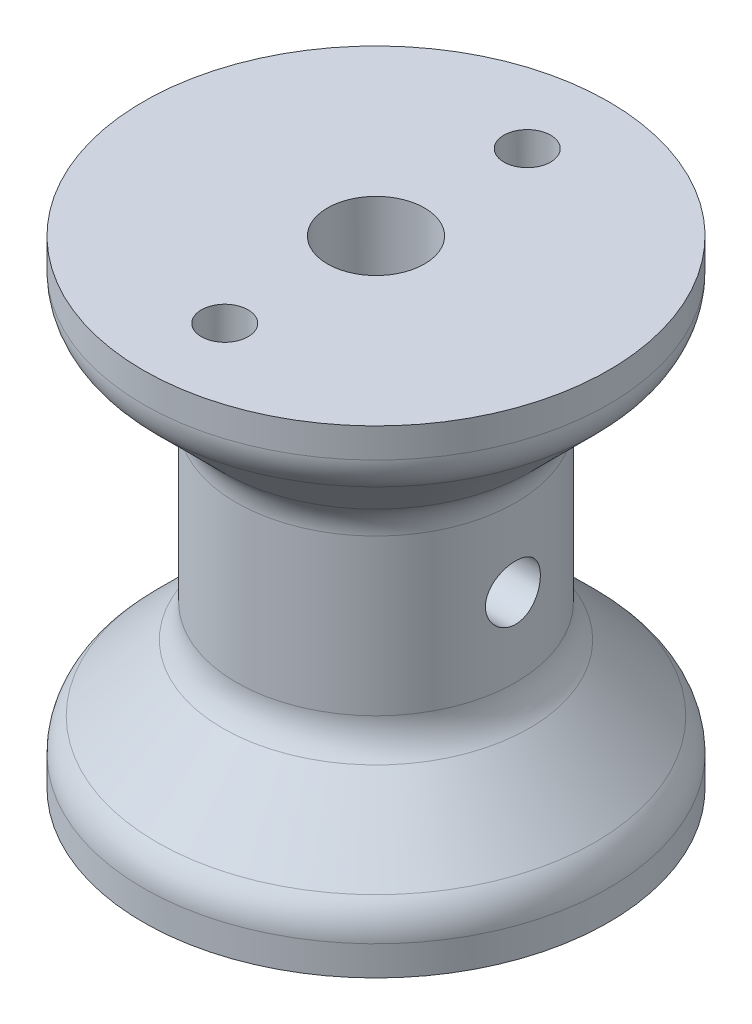
ISO-10303-21;
HEADER;
FILE_DESCRIPTION(('STEP AP214'),'2;1');
FILE_NAME('part.step','',(''),(''),'','','');
FILE_SCHEMA(('AUTOMOTIVE_DESIGN { 1 0 10303 214 1 1 1 1 }'));
ENDSEC;
DATA;
#1=APPLICATION_CONTEXT('core data for automotive mechanical design processes');
#2=APPLICATION_PROTOCOL_DEFINITION('international standard','automotive_design',2000,#1);
#3=PRODUCT_CONTEXT('',#1,'mechanical');
#4=PRODUCT('Part','Part','',(#3));
#5=PRODUCT_RELATED_PRODUCT_CATEGORY('part','',(#4));
#6=PRODUCT_DEFINITION_FORMATION('','',#4);
#7=PRODUCT_DEFINITION_CONTEXT('part definition',#1,'design');
#8=PRODUCT_DEFINITION('design','',#6,#7);
#9=PRODUCT_DEFINITION_SHAPE('','',#8);
#10=(LENGTH_UNIT() NAMED_UNIT(*) SI_UNIT(.MILLI.,.METRE.));
#11=(NAMED_UNIT(*) PLANE_ANGLE_UNIT() SI_UNIT($,.RADIAN.));
#12=(NAMED_UNIT(*) SI_UNIT($,.STERADIAN.) SOLID_ANGLE_UNIT());
#13=UNCERTAINTY_MEASURE_WITH_UNIT(LENGTH_MEASURE(1.E-05),#10,'distance_accuracy_value','');
#14=(GEOMETRIC_REPRESENTATION_CONTEXT(3) GLOBAL_UNCERTAINTY_ASSIGNED_CONTEXT((#13)) GLOBAL_UNIT_ASSIGNED_CONTEXT((#10,
#11,#12)) REPRESENTATION_CONTEXT('',''));
#15=CARTESIAN_POINT('',(0.,0.,0.));
#16=DIRECTION('',(0.,0.,1.));
#17=DIRECTION('',(1.,0.,0.));
#18=AXIS2_PLACEMENT_3D('',#15,#16,#17);
#19=CARTESIAN_POINT('',(0.,31.047,0.));
#20=DIRECTION('',(0.,-1.,0.));
#21=DIRECTION('',(0.,0.,-1.));
#22=AXIS2_PLACEMENT_3D('',#19,#20,#21);
#23=PLANE('',#22);
#24=CARTESIAN_POINT('',(0.,31.047,0.));
#25=DIRECTION('',(0.,-1.,0.));
#26=DIRECTION('',(0.,0.,-1.));
#27=AXIS2_PLACEMENT_3D('',#24,#25,#26);
#28=CIRCLE('',#27,12.7);
#29=CARTESIAN_POINT('',(0.,31.047,-12.7));
#30=VERTEX_POINT('',#29);
#31=EDGE_CURVE('E49',#30,#30,#28,.T.);
#32=ORIENTED_EDGE('',*,*,#31,.F.);
#33=EDGE_LOOP('',(#32));
#34=FACE_BOUND('',#33,.T.);
#35=CARTESIAN_POINT('',(0.,31.047,0.));
#36=DIRECTION('',(0.,-1.,0.));
#37=DIRECTION('',(0.,0.,-1.));
#38=AXIS2_PLACEMENT_3D('',#35,#36,#37);
#39=CIRCLE('',#38,2.64999999999999);
#40=CARTESIAN_POINT('',(0.,31.047,-2.64999999999999));
#41=VERTEX_POINT('',#40);
#42=EDGE_CURVE('E142',#41,#41,#39,.F.);
#43=ORIENTED_EDGE('',*,*,#42,.F.);
#44=EDGE_LOOP('',(#43));
#45=FACE_BOUND('',#44,.T.);
#46=CARTESIAN_POINT('',(0.,31.047,8.255));
#47=DIRECTION('',(0.,-1.,0.));
#48=DIRECTION('',(0.,0.,-1.));
#49=AXIS2_PLACEMENT_3D('',#46,#47,#48);
#50=CIRCLE('',#49,1.275);
#51=CARTESIAN_POINT('',(0.,31.047,6.98));
#52=VERTEX_POINT('',#51);
#53=EDGE_CURVE('E140',#52,#52,#50,.F.);
#54=ORIENTED_EDGE('',*,*,#53,.F.);
#55=EDGE_LOOP('',(#54));
#56=FACE_BOUND('',#55,.T.);
#57=CARTESIAN_POINT('',(0.,31.047,-8.255));
#58=DIRECTION('',(0.,-1.,0.));
#59=DIRECTION('',(0.,0.,-1.));
#60=AXIS2_PLACEMENT_3D('',#57,#58,#59);
#61=CIRCLE('',#60,1.275);
#62=CARTESIAN_POINT('',(0.,31.047,-9.53));
#63=VERTEX_POINT('',#62);
#64=EDGE_CURVE('E136',#63,#63,#61,.F.);
#65=ORIENTED_EDGE('',*,*,#64,.F.);
#66=EDGE_LOOP('',(#65));
#67=FACE_BOUND('',#66,.T.);
#68=ADVANCED_FACE('F45',(#34,#45,#56,#67),#23,.F.);
#69=CARTESIAN_POINT('',(0.,4.953,0.));
#70=DIRECTION('',(0.,1.,0.));
#71=DIRECTION('',(0.,0.,1.));
#72=AXIS2_PLACEMENT_3D('',#69,#70,#71);
#73=PLANE('',#72);
#74=CARTESIAN_POINT('',(0.,4.953,0.));
#75=DIRECTION('',(0.,1.,0.));
#76=DIRECTION('',(-0.199709980514393,0.,0.97985505238425));
#77=AXIS2_PLACEMENT_3D('',#74,#75,#76);
#78=CIRCLE('',#77,12.7);
#79=CARTESIAN_POINT('',(-2.53631675253279,4.953,12.44415916528));
#80=VERTEX_POINT('',#79);
#81=EDGE_CURVE('E126',#80,#80,#78,.T.);
#82=ORIENTED_EDGE('',*,*,#81,.F.);
#83=EDGE_LOOP('',(#82));
#84=FACE_BOUND('',#83,.T.);
#85=CARTESIAN_POINT('',(0.,4.953,0.));
#86=DIRECTION('',(0.,1.,0.));
#87=DIRECTION('',(0.,0.,1.));
#88=AXIS2_PLACEMENT_3D('',#85,#86,#87);
#89=CIRCLE('',#88,2.64999999999999);
#90=CARTESIAN_POINT('',(0.,4.953,2.64999999999999));
#91=VERTEX_POINT('',#90);
#92=EDGE_CURVE('E144',#91,#91,#89,.F.);
#93=ORIENTED_EDGE('',*,*,#92,.F.);
#94=EDGE_LOOP('',(#93));
#95=FACE_BOUND('',#94,.T.);
#96=CARTESIAN_POINT('',(0.,4.953,8.255));
#97=DIRECTION('',(0.,1.,0.));
#98=DIRECTION('',(0.,0.,1.));
#99=AXIS2_PLACEMENT_3D('',#96,#97,#98);
#100=CIRCLE('',#99,1.25);
#101=CARTESIAN_POINT('',(0.,4.953,9.505));
#102=VERTEX_POINT('',#101);
#103=EDGE_CURVE('E139',#102,#102,#100,.F.);
#104=ORIENTED_EDGE('',*,*,#103,.F.);
#105=EDGE_LOOP('',(#104));
#106=FACE_BOUND('',#105,.T.);
#107=CARTESIAN_POINT('',(0.,4.953,-8.255));
#108=DIRECTION('',(0.,1.,0.));
#109=DIRECTION('',(0.,0.,1.));
#110=AXIS2_PLACEMENT_3D('',#107,#108,#109);
#111=CIRCLE('',#110,1.25);
#112=CARTESIAN_POINT('',(0.,4.953,-7.005));
#113=VERTEX_POINT('',#112);
#114=EDGE_CURVE('E154',#113,#113,#111,.F.);
#115=ORIENTED_EDGE('',*,*,#114,.F.);
#116=EDGE_LOOP('',(#115));
#117=FACE_BOUND('',#116,.T.);
#118=ADVANCED_FACE('F89',(#84,#95,#106,#117),#73,.F.);
#119=CARTESIAN_POINT('',(0.,36.,8.255));
#120=DIRECTION('',(0.,1.,0.));
#121=DIRECTION('',(0.,0.,1.));
#122=AXIS2_PLACEMENT_3D('',#119,#120,#121);
#123=CYLINDRICAL_SURFACE('',#122,1.275);
#124=CARTESIAN_POINT('',(0.,26.094,8.255));
#125=DIRECTION('',(0.,1.,0.));
#126=DIRECTION('',(0.,0.,1.));
#127=AXIS2_PLACEMENT_3D('',#124,#125,#126);
#128=CIRCLE('',#127,1.275);
#129=CARTESIAN_POINT('',(0.,26.094,9.53));
#130=VERTEX_POINT('',#129);
#131=EDGE_CURVE('E128',#130,#130,#128,.T.);
#132=ORIENTED_EDGE('',*,*,#131,.F.);
#133=EDGE_LOOP('',(#132));
#134=FACE_BOUND('',#133,.T.);
#135=ORIENTED_EDGE('',*,*,#53,.T.);
#136=EDGE_LOOP('',(#135));
#137=FACE_BOUND('',#136,.T.);
#138=ADVANCED_FACE('F80',(#134,#137),#123,.F.);
#139=CARTESIAN_POINT('',(0.,26.094,8.255));
#140=DIRECTION('',(0.,1.,0.));
#141=DIRECTION('',(0.,0.,1.));
#142=AXIS2_PLACEMENT_3D('',#139,#140,#141);
#143=CONICAL_SURFACE('',#142,1.275,0.872664625997162);
#144=ORIENTED_EDGE('',*,*,#131,.T.);
#145=EDGE_LOOP('',(#144));
#146=FACE_BOUND('',#145,.T.);
#147=CARTESIAN_POINT('',(0.,25.024147970249,8.255));
#148=VERTEX_POINT('',#147);
#149=VERTEX_LOOP('',#148);
#150=FACE_BOUND('',#149,.T.);
#151=ADVANCED_FACE('F82',(#146,#150),#143,.F.);
#152=CARTESIAN_POINT('',(0.,36.,-8.255));
#153=DIRECTION('',(0.,1.,0.));
#154=DIRECTION('',(0.,0.,1.));
#155=AXIS2_PLACEMENT_3D('',#152,#153,#154);
#156=CYLINDRICAL_SURFACE('',#155,1.275);
#157=CARTESIAN_POINT('',(0.,26.094,-8.255));
#158=DIRECTION('',(0.,1.,0.));
#159=DIRECTION('',(0.,0.,1.));
#160=AXIS2_PLACEMENT_3D('',#157,#158,#159);
#161=CIRCLE('',#160,1.275);
#162=CARTESIAN_POINT('',(0.,26.094,-6.98));
#163=VERTEX_POINT('',#162);
#164=EDGE_CURVE('E131',#163,#163,#161,.T.);
#165=ORIENTED_EDGE('',*,*,#164,.F.);
#166=EDGE_LOOP('',(#165));
#167=FACE_BOUND('',#166,.T.);
#168=ORIENTED_EDGE('',*,*,#64,.T.);
#169=EDGE_LOOP('',(#168));
#170=FACE_BOUND('',#169,.T.);
#171=ADVANCED_FACE('F232',(#167,#170),#156,.F.);
#172=CARTESIAN_POINT('',(0.,26.094,-8.255));
#173=DIRECTION('',(0.,1.,0.));
#174=DIRECTION('',(0.,0.,1.));
#175=AXIS2_PLACEMENT_3D('',#172,#173,#174);
#176=CONICAL_SURFACE('',#175,1.275,0.872664625997162);
#177=ORIENTED_EDGE('',*,*,#164,.T.);
#178=EDGE_LOOP('',(#177));
#179=FACE_BOUND('',#178,.T.);
#180=CARTESIAN_POINT('',(0.,25.024147970249,-8.255));
#181=VERTEX_POINT('',#180);
#182=VERTEX_LOOP('',#181);
#183=FACE_BOUND('',#182,.T.);
#184=ADVANCED_FACE('F87',(#179,#183),#176,.F.);
#185=CARTESIAN_POINT('',(0.,0.,8.255));
#186=DIRECTION('',(0.,-1.,0.));
#187=DIRECTION('',(0.,0.,-1.));
#188=AXIS2_PLACEMENT_3D('',#185,#186,#187);
#189=CYLINDRICAL_SURFACE('',#188,1.25);
#190=CARTESIAN_POINT('',(0.,9.906,8.255));
#191=DIRECTION('',(0.,-1.,0.));
#192=DIRECTION('',(0.,0.,-1.));
#193=AXIS2_PLACEMENT_3D('',#190,#191,#192);
#194=CIRCLE('',#193,1.25);
#195=CARTESIAN_POINT('',(0.,9.906,7.005));
#196=VERTEX_POINT('',#195);
#197=EDGE_CURVE('E54',#196,#196,#194,.T.);
#198=ORIENTED_EDGE('',*,*,#197,.F.);
#199=EDGE_LOOP('',(#198));
#200=FACE_BOUND('',#199,.T.);
#201=ORIENTED_EDGE('',*,*,#103,.T.);
#202=EDGE_LOOP('',(#201));
#203=FACE_BOUND('',#202,.T.);
#204=ADVANCED_FACE('F83',(#200,#203),#189,.F.);
#205=CARTESIAN_POINT('',(0.,9.906,8.255));
#206=DIRECTION('',(0.,-1.,0.));
#207=DIRECTION('',(0.,0.,-1.));
#208=AXIS2_PLACEMENT_3D('',#205,#206,#207);
#209=CONICAL_SURFACE('',#208,1.25,0.872664625997163);
#210=ORIENTED_EDGE('',*,*,#197,.T.);
#211=EDGE_LOOP('',(#210));
#212=FACE_BOUND('',#211,.T.);
#213=CARTESIAN_POINT('',(0.,10.9548745389716,8.255));
#214=VERTEX_POINT('',#213);
#215=VERTEX_LOOP('',#214);
#216=FACE_BOUND('',#215,.T.);
#217=ADVANCED_FACE('F72',(#212,#216),#209,.F.);
#218=CARTESIAN_POINT('',(0.,0.,-8.255));
#219=DIRECTION('',(0.,-1.,0.));
#220=DIRECTION('',(0.,0.,-1.));
#221=AXIS2_PLACEMENT_3D('',#218,#219,#220);
#222=CYLINDRICAL_SURFACE('',#221,1.25);
#223=CARTESIAN_POINT('',(0.,9.906,-8.255));
#224=DIRECTION('',(0.,-1.,0.));
#225=DIRECTION('',(0.,0.,-1.));
#226=AXIS2_PLACEMENT_3D('',#223,#224,#225);
#227=CIRCLE('',#226,1.25);
#228=CARTESIAN_POINT('',(0.,9.906,-9.505));
#229=VERTEX_POINT('',#228);
#230=EDGE_CURVE('E12',#229,#229,#227,.T.);
#231=ORIENTED_EDGE('',*,*,#230,.F.);
#232=EDGE_LOOP('',(#231));
#233=FACE_BOUND('',#232,.T.);
#234=ORIENTED_EDGE('',*,*,#114,.T.);
#235=EDGE_LOOP('',(#234));
#236=FACE_BOUND('',#235,.T.);
#237=ADVANCED_FACE('F70',(#233,#236),#222,.F.);
#238=CARTESIAN_POINT('',(0.,9.906,-8.255));
#239=DIRECTION('',(0.,-1.,0.));
#240=DIRECTION('',(0.,0.,-1.));
#241=AXIS2_PLACEMENT_3D('',#238,#239,#240);
#242=CONICAL_SURFACE('',#241,1.25,0.872664625997163);
#243=ORIENTED_EDGE('',*,*,#230,.T.);
#244=EDGE_LOOP('',(#243));
#245=FACE_BOUND('',#244,.T.);
#246=CARTESIAN_POINT('',(0.,10.9548745389716,-8.255));
#247=VERTEX_POINT('',#246);
#248=VERTEX_LOOP('',#247);
#249=FACE_BOUND('',#248,.T.);
#250=ADVANCED_FACE('F47',(#245,#249),#242,.F.);
#251=CARTESIAN_POINT('',(0.,13.7521024484277,0.));
#252=DIRECTION('',(0.,1.,0.));
#253=DIRECTION('',(0.,0.,1.));
#254=AXIS2_PLACEMENT_3D('',#251,#252,#253);
#255=TOROIDAL_SURFACE('',#254,10.16,2.54);
#256=CARTESIAN_POINT('',(0.,11.9560512242139,0.));
#257=DIRECTION('',(0.,1.,0.));
#258=DIRECTION('',(0.,0.,1.));
#259=AXIS2_PLACEMENT_3D('',#256,#257,#258);
#260=CIRCLE('',#259,8.36394877578616);
#261=CARTESIAN_POINT('',(0.,11.9560512242139,8.36394877578616));
#262=VERTEX_POINT('',#261);
#263=EDGE_CURVE('E201',#262,#262,#260,.F.);
#264=ORIENTED_EDGE('',*,*,#263,.F.);
#265=EDGE_LOOP('',(#264));
#266=FACE_BOUND('',#265,.T.);
#267=CARTESIAN_POINT('',(0.,13.7521024484277,0.));
#268=DIRECTION('',(0.,1.,0.));
#269=DIRECTION('',(0.,0.,1.));
#270=AXIS2_PLACEMENT_3D('',#267,#268,#269);
#271=CIRCLE('',#270,7.62);
#272=CARTESIAN_POINT('',(0.,13.7521024484277,7.62));
#273=VERTEX_POINT('',#272);
#274=EDGE_CURVE('E204',#273,#273,#271,.T.);
#275=ORIENTED_EDGE('',*,*,#274,.F.);
#276=EDGE_LOOP('',(#275));
#277=FACE_BOUND('',#276,.T.);
#278=ADVANCED_FACE('F69',(#266,#277),#255,.F.);
#279=CARTESIAN_POINT('',(0.,22.2478975515724,0.));
#280=DIRECTION('',(0.,-1.,0.));
#281=DIRECTION('',(0.,0.,-1.));
#282=AXIS2_PLACEMENT_3D('',#279,#280,#281);
#283=TOROIDAL_SURFACE('',#282,10.16,2.54);
#284=CARTESIAN_POINT('',(0.,24.0439487757862,0.));
#285=DIRECTION('',(0.,-1.,0.));
#286=DIRECTION('',(0.,0.,-1.));
#287=AXIS2_PLACEMENT_3D('',#284,#285,#286);
#288=CIRCLE('',#287,8.36394877578618);
#289=CARTESIAN_POINT('',(0.,24.0439487757862,-8.36394877578618));
#290=VERTEX_POINT('',#289);
#291=EDGE_CURVE('E213',#290,#290,#288,.F.);
#292=ORIENTED_EDGE('',*,*,#291,.F.);
#293=EDGE_LOOP('',(#292));
#294=FACE_BOUND('',#293,.T.);
#295=CARTESIAN_POINT('',(0.,22.2478975515724,0.));
#296=DIRECTION('',(0.,-1.,0.));
#297=DIRECTION('',(0.,0.,-1.));
#298=AXIS2_PLACEMENT_3D('',#295,#296,#297);
#299=CIRCLE('',#298,7.62);
#300=CARTESIAN_POINT('',(0.,22.2478975515724,-7.62));
#301=VERTEX_POINT('',#300);
#302=EDGE_CURVE('E200',#301,#301,#299,.T.);
#303=ORIENTED_EDGE('',*,*,#302,.F.);
#304=EDGE_LOOP('',(#303));
#305=FACE_BOUND('',#304,.T.);
#306=ADVANCED_FACE('F77',(#294,#305),#283,.F.);
#307=CARTESIAN_POINT('',(0.,36.,0.));
#308=DIRECTION('',(0.,1.,0.));
#309=DIRECTION('',(0.,0.,1.));
#310=AXIS2_PLACEMENT_3D('',#307,#308,#309);
#311=CYLINDRICAL_SURFACE('',#310,7.62);
#312=CARTESIAN_POINT('',(7.47090355981123,18.,1.5));
#313=CARTESIAN_POINT('',(7.47090520805717,17.9166248697322,1.49999688667569));
#314=CARTESIAN_POINT('',(7.47231442681914,17.8332102273004,1.49302498467958));
#315=CARTESIAN_POINT('',(7.47779108548907,17.6687387150346,1.46534368041796));
#316=CARTESIAN_POINT('',(7.48186068530205,17.5876838169251,1.44462311570956));
#317=CARTESIAN_POINT('',(7.49217974357388,17.4303351424225,1.39011024826719));
#318=CARTESIAN_POINT('',(7.49842706882551,17.3540367926227,1.35633073400692));
#319=CARTESIAN_POINT('',(7.51239512823989,17.2081930484743,1.27669356704875));
#320=CARTESIAN_POINT('',(7.52011577176075,17.1386472390911,1.23083665731379));
#321=CARTESIAN_POINT('',(7.53627873837158,17.0073256711852,1.1276765561572));
#322=CARTESIAN_POINT('',(7.54472876456221,16.9456559077998,1.07023961991119));
#323=CARTESIAN_POINT('',(7.56133053263847,16.8327618883664,0.945838878484098));
#324=CARTESIAN_POINT('',(7.56948225393127,16.7815383523395,0.878874417144499));
#325=CARTESIAN_POINT('',(7.58465187068536,16.6905808509488,0.736619054972529));
#326=CARTESIAN_POINT('',(7.59165962595855,16.6509474094388,0.661262705593442));
#327=CARTESIAN_POINT('',(7.60366527379057,16.5849435467272,0.504799554369323));
#328=CARTESIAN_POINT('',(7.60866334855343,16.5585719231129,0.423693274615898));
#329=CARTESIAN_POINT('',(7.61603207040408,16.5201696855893,0.259132173351439));
#330=CARTESIAN_POINT('',(7.61843546854053,16.5079601617707,0.175720593442719));
#331=CARTESIAN_POINT('',(7.62045709300594,16.4976707056745,0.00800065804928567));
#332=CARTESIAN_POINT('',(7.62007557967622,16.4995894526469,-0.0763076128744921));
#333=CARTESIAN_POINT('',(7.61659580111552,16.5173659848361,-0.242198971370359));
#334=CARTESIAN_POINT('',(7.61353509413565,16.5330310745491,-0.323803609990288));
#335=CARTESIAN_POINT('',(7.60508312700692,16.5775502019311,-0.483202858537767));
#336=CARTESIAN_POINT('',(7.59969177569407,16.6064047555132,-0.560997319296302));
#337=CARTESIAN_POINT('',(7.58712216935132,16.676663559549,-0.711120003966204));
#338=CARTESIAN_POINT('',(7.57993315706898,16.7181436987751,-0.783411773726323));
#339=CARTESIAN_POINT('',(7.56456139033291,16.8124201118775,-0.920080200750645));
#340=CARTESIAN_POINT('',(7.55637852498506,16.8652176490525,-0.984455973132264));
#341=CARTESIAN_POINT('',(7.53976047119928,16.9816884687979,-1.10460809268301));
#342=CARTESIAN_POINT('',(7.53132335536144,17.0455303787417,-1.16022083367651));
#343=CARTESIAN_POINT('',(7.51527907360137,17.181719032198,-1.25997654442849));
#344=CARTESIAN_POINT('',(7.50767192241448,17.2540659266622,-1.30411931056624));
#345=CARTESIAN_POINT('',(7.49414533987624,17.4054411939047,-1.37973591366047));
#346=CARTESIAN_POINT('',(7.48822935065979,17.4844827751313,-1.41118396505073));
#347=CARTESIAN_POINT('',(7.47880596335929,17.6468711080218,-1.46030587895222));
#348=CARTESIAN_POINT('',(7.47529826202851,17.7302173162341,-1.47798147570075));
#349=CARTESIAN_POINT('',(7.47114916301986,17.8973681174636,-1.49881367298144));
#350=CARTESIAN_POINT('',(7.47046118988075,17.9811421796678,-1.50220622260962));
#351=CARTESIAN_POINT('',(7.47190452155432,18.1480593378862,-1.49501031410193));
#352=CARTESIAN_POINT('',(7.47403567180594,18.2312024682403,-1.48442262244582));
#353=CARTESIAN_POINT('',(7.48083356676656,18.393709037858,-1.44976997146309));
#354=CARTESIAN_POINT('',(7.48547669619077,18.4731003067735,-1.42583046961495));
#355=CARTESIAN_POINT('',(7.49675477143226,18.6267450195856,-1.36528763220621));
#356=CARTESIAN_POINT('',(7.50338987693001,18.7009980510043,-1.32868328137226));
#357=CARTESIAN_POINT('',(7.51800929871199,18.843292778427,-1.24331339940792));
#358=CARTESIAN_POINT('',(7.52600962302392,18.911244003286,-1.19439986520732));
#359=CARTESIAN_POINT('',(7.54241384228045,19.0380599054564,-1.08599796666761));
#360=CARTESIAN_POINT('',(7.55081777734125,19.096923677075,-1.02650854956236));
#361=CARTESIAN_POINT('',(7.56723308372522,19.2047849626328,-0.897585739681159));
#362=CARTESIAN_POINT('',(7.5752367820851,19.2536231603058,-0.828017923279644));
#363=CARTESIAN_POINT('',(7.58981751008306,19.3389183884121,-0.681527809137338));
#364=CARTESIAN_POINT('',(7.59639459840388,19.3753759281514,-0.604605814093895));
#365=CARTESIAN_POINT('',(7.60734822316011,19.4346411103594,-0.446015183465939));
#366=CARTESIAN_POINT('',(7.61173695400547,19.457524531928,-0.364375746021884));
#367=CARTESIAN_POINT('',(7.61787160347894,19.4892324673403,-0.198317054442912));
#368=CARTESIAN_POINT('',(7.6196178299986,19.4980586190737,-0.113898125331916));
#369=CARTESIAN_POINT('',(7.62026373659984,19.5013396876628,0.0537999060172786));
#370=CARTESIAN_POINT('',(7.61921091606354,19.4960344097195,0.137074227014264));
#371=CARTESIAN_POINT('',(7.61447659220172,19.4717316018189,0.301520005463067));
#372=CARTESIAN_POINT('',(7.61079511983287,19.4527342331085,0.382691487667596));
#373=CARTESIAN_POINT('',(7.60121813690842,19.4016916892099,0.540483837297881));
#374=CARTESIAN_POINT('',(7.59532737467921,19.3696744846141,0.617114058911594));
#375=CARTESIAN_POINT('',(7.58196696738841,19.2935310168211,0.763949465097649));
#376=CARTESIAN_POINT('',(7.57449720236634,19.2494038335248,0.834154160926946));
#377=CARTESIAN_POINT('',(7.55865324474365,19.1494798329435,0.967333787700755));
#378=CARTESIAN_POINT('',(7.550266715712,19.0935110148304,1.03017821425317));
#379=CARTESIAN_POINT('',(7.53360887945019,18.9718468152732,1.14566576772233));
#380=CARTESIAN_POINT('',(7.52533759992031,18.9061491381535,1.19830648012642));
#381=CARTESIAN_POINT('',(7.50975247322432,18.7660751009397,1.29240965679267));
#382=CARTESIAN_POINT('',(7.50244944754768,18.6916157854841,1.33375050432825));
#383=CARTESIAN_POINT('',(7.48975935066761,18.5366857391843,1.40326892997983));
#384=CARTESIAN_POINT('',(7.48437052425566,18.4562205977012,1.43145857445049));
#385=CARTESIAN_POINT('',(7.47720706691482,18.3129656395813,1.46834011791826));
#386=CARTESIAN_POINT('',(7.47485774307645,18.2509986382934,1.4801915631641));
#387=CARTESIAN_POINT('',(7.47170539167145,18.1260285949528,1.496022553026));
#388=CARTESIAN_POINT('',(7.47090231385614,18.0630255866347,1.50000235344869));
#389=CARTESIAN_POINT('',(7.47090355981123,18.,1.5));
#390=B_SPLINE_CURVE_WITH_KNOTS('',3,(#312,#313,#314,#315,#316,#317,#318,#319,#320,#321,#322,
#323,#324,#325,#326,#327,#328,#329,#330,#331,#332,#333,#334,#335,#336,#337,#338,#339,#340,#341,
#342,#343,#344,#345,#346,#347,#348,#349,#350,#351,#352,#353,#354,#355,#356,#357,#358,#359,#360,
#361,#362,#363,#364,#365,#366,#367,#368,#369,#370,#371,#372,#373,#374,#375,#376,#377,#378,#379,
#380,#381,#382,#383,#384,#385,#386,#387,#388,#389),.UNSPECIFIED.,.T.,.F.,(4,2,2,2,2,2,2,2,2,2,2,
2,2,2,2,2,2,2,2,2,2,2,2,2,2,2,2,2,2,2,2,2,2,2,2,2,2,2,4),(0.,0.249894656722435,
0.499992449825667,0.749845943023173,0.999684069617368,1.25259262055003,1.50551859767682,
1.76057728494712,2.01561284256938,2.26739018330723,2.51914398749612,2.76742410432191,
3.01571393359305,3.26552666298579,3.51536729213081,3.76942766624242,4.02349255025294,
4.27807092632522,4.53261724052433,4.78294165868997,5.03325235315613,5.28124974524544,
5.52926702257013,5.78042219658798,6.03160238562066,6.28650874100436,6.54140460897812,
6.79486376188188,7.0482933807046,7.29744990425442,7.54660349362585,7.79522462899913,
8.04386465948651,8.29640022772462,8.54899548089062,8.80421091828232,9.05919173029629,
9.24810021097508,9.43700255255132),.UNSPECIFIED.);
#391=CARTESIAN_POINT('',(7.47090355981123,18.,1.5));
#392=VERTEX_POINT('',#391);
#393=EDGE_CURVE('E125',#392,#392,#390,.T.);
#394=ORIENTED_EDGE('',*,*,#393,.F.);
#395=EDGE_LOOP('',(#394));
#396=FACE_BOUND('',#395,.T.);
#397=ORIENTED_EDGE('',*,*,#302,.T.);
#398=EDGE_LOOP('',(#397));
#399=FACE_BOUND('',#398,.T.);
#400=ORIENTED_EDGE('',*,*,#274,.T.);
#401=EDGE_LOOP('',(#400));
#402=FACE_BOUND('',#401,.T.);
#403=ADVANCED_FACE('F164',(#396,#399,#402),#311,.T.);
#404=CARTESIAN_POINT('',(0.,18.,0.));
#405=DIRECTION('',(-1.,0.,0.));
#406=DIRECTION('',(0.,0.,1.));
#407=AXIS2_PLACEMENT_3D('',#404,#405,#406);
#408=CYLINDRICAL_SURFACE('',#407,1.5);
#409=ORIENTED_EDGE('',*,*,#393,.T.);
#410=EDGE_LOOP('',(#409));
#411=FACE_BOUND('',#410,.T.);
#412=CARTESIAN_POINT('',(2.18460522749534,18.,1.5));
#413=CARTESIAN_POINT('',(2.18460861667953,17.9235282294698,1.49999775812328));
#414=CARTESIAN_POINT('',(2.1886812464552,17.8470399388562,1.49411532702291));
#415=CARTESIAN_POINT('',(2.20430109850564,17.6965677536928,1.47096580037665));
#416=CARTESIAN_POINT('',(2.21585648565315,17.6225866878275,1.45368626840703));
#417=CARTESIAN_POINT('',(2.24464674062272,17.479588698284,1.4088145797611));
#418=CARTESIAN_POINT('',(2.26184535422725,17.4105434265359,1.38128810530108));
#419=CARTESIAN_POINT('',(2.29992165526899,17.2780762933706,1.31691162153586));
#420=CARTESIAN_POINT('',(2.32080050846541,17.2146562233991,1.28005865633837));
#421=CARTESIAN_POINT('',(2.36660725190877,17.0877487775731,1.19344748770474));
#422=CARTESIAN_POINT('',(2.3917291188922,17.0249874803198,1.14272770062155));
#423=CARTESIAN_POINT('',(2.4416352750263,16.9082732138381,1.0318041216689));
#424=CARTESIAN_POINT('',(2.4664193411339,16.8543258283498,0.971594364849288));
#425=CARTESIAN_POINT('',(2.51558700553529,16.7518480937017,0.836623467298188));
#426=CARTESIAN_POINT('',(2.53972133387703,16.7042809265879,0.761031378369246));
#427=CARTESIAN_POINT('',(2.58219959374186,16.6228790136692,0.60129238811217));
#428=CARTESIAN_POINT('',(2.60054821439838,16.5890331407991,0.517152488027639));
#429=CARTESIAN_POINT('',(2.62796129860138,16.5391528582126,0.350457552994093));
#430=CARTESIAN_POINT('',(2.63769515648449,16.5218239475252,0.268402676717255));
#431=CARTESIAN_POINT('',(2.64934393144785,16.5011335084999,0.102026419207446));
#432=CARTESIAN_POINT('',(2.6512651846276,16.4977606616174,0.0177069304914898));
#433=CARTESIAN_POINT('',(2.64731387571438,16.5047501152259,-0.14075982777513));
#434=CARTESIAN_POINT('',(2.64228076913763,16.5136328723223,-0.214999611129792));
#435=CARTESIAN_POINT('',(2.62635652192405,16.5421288722744,-0.360726969421543));
#436=CARTESIAN_POINT('',(2.61546495098705,16.5617429033365,-0.432214341782589));
#437=CARTESIAN_POINT('',(2.5886549645056,16.6110917132167,-0.571347545261562));
#438=CARTESIAN_POINT('',(2.57269030879449,16.6409197932676,-0.638951002804897));
#439=CARTESIAN_POINT('',(2.53706643929769,16.7096247865375,-0.768310870386311));
#440=CARTESIAN_POINT('',(2.51740611345083,16.7485044242956,-0.830065512028373));
#441=CARTESIAN_POINT('',(2.47352889689273,16.8391418448547,-0.95336245623778));
#442=CARTESIAN_POINT('',(2.44904832761113,16.8918532761158,-1.01410967647964));
#443=CARTESIAN_POINT('',(2.39948496633962,17.0061773883718,-1.12638674525492));
#444=CARTESIAN_POINT('',(2.37440149206767,17.0678005921133,-1.17790553386036));
#445=CARTESIAN_POINT('',(2.32368878555666,17.2053271513838,-1.27525013141648));
#446=CARTESIAN_POINT('',(2.29824118692973,17.2820350864781,-1.32004420787486));
#447=CARTESIAN_POINT('',(2.25304776862359,17.4435115705046,-1.39579245564223));
#448=CARTESIAN_POINT('',(2.23329198143814,17.5282656785179,-1.42677087373947));
#449=CARTESIAN_POINT('',(2.20636436355604,17.6837469494296,-1.46796403945407));
#450=CARTESIAN_POINT('',(2.19736068261283,17.7533355971771,-1.48128343301366));
#451=CARTESIAN_POINT('',(2.18604254748302,17.8942102776831,-1.49794064544973));
#452=CARTESIAN_POINT('',(2.18372191369085,17.9654946808803,-1.50128768555004));
#453=CARTESIAN_POINT('',(2.18610194316526,18.1077210610334,-1.49781875778892));
#454=CARTESIAN_POINT('',(2.19080588079816,18.178662862826,-1.49099805043388));
#455=CARTESIAN_POINT('',(2.2065647053668,18.3181953578204,-1.46757118465246));
#456=CARTESIAN_POINT('',(2.21762413823845,18.3867843308469,-1.4509580216946));
#457=CARTESIAN_POINT('',(2.24489923439453,18.521024071067,-1.40839244614836));
#458=CARTESIAN_POINT('',(2.26118835832875,18.5866167699589,-1.38230623778854));
#459=CARTESIAN_POINT('',(2.29714313417544,18.7127623117628,-1.32169339369987));
#460=CARTESIAN_POINT('',(2.31681018113646,18.7733130569958,-1.28716326821067));
#461=CARTESIAN_POINT('',(2.36118131506749,18.8981184524627,-1.20411045286679));
#462=CARTESIAN_POINT('',(2.38618334364972,18.9613615357933,-1.15422329918451));
#463=CARTESIAN_POINT('',(2.43602722426256,19.0791567209278,-1.04493227789817));
#464=CARTESIAN_POINT('',(2.4608689314616,19.1337017992206,-0.98552079638353));
#465=CARTESIAN_POINT('',(2.51039117115719,19.2376784540442,-0.852035472327319));
#466=CARTESIAN_POINT('',(2.53483358232808,19.2861363774392,-0.777105858883321));
#467=CARTESIAN_POINT('',(2.5781047540591,19.3694498908946,-0.618552265272648));
#468=CARTESIAN_POINT('',(2.59693802742521,19.40431642286,-0.534935347898281));
#469=CARTESIAN_POINT('',(2.62547681712749,19.4563863903304,-0.368633034887066));
#470=CARTESIAN_POINT('',(2.63580710173198,19.4748095474212,-0.2864397189204));
#471=CARTESIAN_POINT('',(2.64862037482932,19.497592468684,-0.11954831117791));
#472=CARTESIAN_POINT('',(2.65110997490144,19.5019640817449,-0.034852390570893));
#473=CARTESIAN_POINT('',(2.64814324483744,19.496716674974,0.124307141372254));
#474=CARTESIAN_POINT('',(2.64355453766682,19.488625456895,0.198843680538192));
#475=CARTESIAN_POINT('',(2.62843892449673,19.4616143748673,0.345293191198127));
#476=CARTESIAN_POINT('',(2.61791167190617,19.4426938788891,0.417206009303164));
#477=CARTESIAN_POINT('',(2.59179454663301,19.3947413850799,0.55694042798981));
#478=CARTESIAN_POINT('',(2.5761818653601,19.3656637884079,0.624741932773311));
#479=CARTESIAN_POINT('',(2.54118128506188,19.2984318578026,0.754603705894067));
#480=CARTESIAN_POINT('',(2.52179231127292,19.260274939133,0.816662332326386));
#481=CARTESIAN_POINT('',(2.47842400482684,19.171222575227,0.940575007122659));
#482=CARTESIAN_POINT('',(2.45417443792725,19.1193888905365,1.00165977239307));
#483=CARTESIAN_POINT('',(2.40491904956599,19.0068259397853,1.11475476979392));
#484=CARTESIAN_POINT('',(2.37991235551652,18.9460860736461,1.16675402450022));
#485=CARTESIAN_POINT('',(2.32906292642141,18.8101842257495,1.26544233785446));
#486=CARTESIAN_POINT('',(2.30338751963143,18.7341869618013,1.31107712212969));
#487=CARTESIAN_POINT('',(2.25747275125307,18.5740357147933,1.38865500097859));
#488=CARTESIAN_POINT('',(2.23722363866246,18.4898967378612,1.4206227175653));
#489=CARTESIAN_POINT('',(2.20966776125517,18.3379424864589,1.46298808788582));
#490=CARTESIAN_POINT('',(2.2003773628411,18.2714361450508,1.47680747425965));
#491=CARTESIAN_POINT('',(2.18784693584738,18.1366233023392,1.49531087770829));
#492=CARTESIAN_POINT('',(2.18460219967069,18.0683182437182,1.50000200284469));
#493=CARTESIAN_POINT('',(2.18460522749534,18.,1.5));
#494=B_SPLINE_CURVE_WITH_KNOTS('',3,(#412,#413,#414,#415,#416,#417,#418,#419,#420,#421,#422,
#423,#424,#425,#426,#427,#428,#429,#430,#431,#432,#433,#434,#435,#436,#437,#438,#439,#440,#441,
#442,#443,#444,#445,#446,#447,#448,#449,#450,#451,#452,#453,#454,#455,#456,#457,#458,#459,#460,
#461,#462,#463,#464,#465,#466,#467,#468,#469,#470,#471,#472,#473,#474,#475,#476,#477,#478,#479,
#480,#481,#482,#483,#484,#485,#486,#487,#488,#489,#490,#491,#492,#493),.UNSPECIFIED.,.T.,.F.,(4,
2,2,2,2,2,2,2,2,2,2,2,2,2,2,2,2,2,2,2,2,2,2,2,2,2,2,2,2,2,2,2,2,2,2,2,2,2,2,2,4),(0.,
0.229129912324709,0.458510263904318,0.686444934272552,0.914451935807399,1.16697667642266,
1.41966077992687,1.69572667711522,1.97156825307578,2.22338654643134,2.47500057188572,
2.69875327072843,2.92252240629758,3.14839266112584,3.37433099150985,3.62552047112809,
3.87700900659275,4.15280804694841,4.42812113050271,4.64144425336402,4.85457005954297,
5.06779524115406,5.28117312787999,5.49769005004579,5.71429660750365,5.96629811369341,
6.2185020881041,6.49459368719457,6.77046255426242,7.02357625923066,7.27647647135812,
7.50074680365695,7.72503022639058,7.950333759808,8.17570151039905,8.42579245845554,
8.6761835162547,8.95166563830465,9.22664935035993,9.43150869723678,9.63620845879309),.UNSPECIFIED.);
#495=CARTESIAN_POINT('',(2.18460522749534,18.,1.5));
#496=VERTEX_POINT('',#495);
#497=EDGE_CURVE('E118',#496,#496,#494,.T.);
#498=ORIENTED_EDGE('',*,*,#497,.F.);
#499=EDGE_LOOP('',(#498));
#500=FACE_BOUND('',#499,.T.);
#501=ADVANCED_FACE('F102',(#411,#500),#408,.F.);
#502=CARTESIAN_POINT('',(0.,36.,0.));
#503=DIRECTION('',(0.,1.,0.));
#504=DIRECTION('',(0.,0.,1.));
#505=AXIS2_PLACEMENT_3D('',#502,#503,#504);
#506=CYLINDRICAL_SURFACE('',#505,2.64999999999999);
#507=ORIENTED_EDGE('',*,*,#92,.T.);
#508=EDGE_LOOP('',(#507));
#509=FACE_BOUND('',#508,.T.);
#510=ORIENTED_EDGE('',*,*,#42,.T.);
#511=EDGE_LOOP('',(#510));
#512=FACE_BOUND('',#511,.T.);
#513=ORIENTED_EDGE('',*,*,#497,.T.);
#514=EDGE_LOOP('',(#513));
#515=FACE_BOUND('',#514,.T.);
#516=ADVANCED_FACE('F110',(#509,#512,#515),#506,.F.);
#517=CARTESIAN_POINT('',(0.,28.38,0.));
#518=DIRECTION('',(0.,1.,0.));
#519=DIRECTION('',(0.,0.,1.));
#520=AXIS2_PLACEMENT_3D('',#517,#518,#519);
#521=CONICAL_SURFACE('',#520,12.7,0.785398163397454);
#522=CARTESIAN_POINT('',(0.,27.6360512242138,0.));
#523=DIRECTION('',(0.,-1.,0.));
#524=DIRECTION('',(0.,0.,-1.));
#525=AXIS2_PLACEMENT_3D('',#522,#523,#524);
#526=CIRCLE('',#525,11.9560512242138);
#527=CARTESIAN_POINT('',(0.,27.6360512242138,-11.9560512242138));
#528=VERTEX_POINT('',#527);
#529=EDGE_CURVE('E210',#528,#528,#526,.T.);
#530=ORIENTED_EDGE('',*,*,#529,.T.);
#531=EDGE_LOOP('',(#530));
#532=FACE_BOUND('',#531,.T.);
#533=ORIENTED_EDGE('',*,*,#291,.T.);
#534=EDGE_LOOP('',(#533));
#535=FACE_BOUND('',#534,.T.);
#536=ADVANCED_FACE('F114',(#532,#535),#521,.T.);
#537=CARTESIAN_POINT('',(0.,29.4321024484276,0.));
#538=DIRECTION('',(0.,-1.,0.));
#539=DIRECTION('',(0.,0.,-1.));
#540=AXIS2_PLACEMENT_3D('',#537,#538,#539);
#541=TOROIDAL_SURFACE('',#540,10.16,2.54);
#542=ORIENTED_EDGE('',*,*,#529,.F.);
#543=EDGE_LOOP('',(#542));
#544=FACE_BOUND('',#543,.T.);
#545=CARTESIAN_POINT('',(0.,29.4321024484276,0.));
#546=DIRECTION('',(0.,-1.,0.));
#547=DIRECTION('',(0.,0.,-1.));
#548=AXIS2_PLACEMENT_3D('',#545,#546,#547);
#549=CIRCLE('',#548,12.7);
#550=CARTESIAN_POINT('',(0.,29.4321024484276,-12.7));
#551=VERTEX_POINT('',#550);
#552=EDGE_CURVE('E215',#551,#551,#549,.F.);
#553=ORIENTED_EDGE('',*,*,#552,.F.);
#554=EDGE_LOOP('',(#553));
#555=FACE_BOUND('',#554,.T.);
#556=ADVANCED_FACE('F175',(#544,#555),#541,.T.);
#557=CARTESIAN_POINT('',(0.,36.,0.));
#558=DIRECTION('',(0.,-1.,0.));
#559=DIRECTION('',(0.,0.,-1.));
#560=AXIS2_PLACEMENT_3D('',#557,#558,#559);
#561=CYLINDRICAL_SURFACE('',#560,12.7);
#562=ORIENTED_EDGE('',*,*,#552,.T.);
#563=EDGE_LOOP('',(#562));
#564=FACE_BOUND('',#563,.T.);
#565=ORIENTED_EDGE('',*,*,#31,.T.);
#566=EDGE_LOOP('',(#565));
#567=FACE_BOUND('',#566,.T.);
#568=ADVANCED_FACE('F109',(#564,#567),#561,.T.);
#569=CARTESIAN_POINT('',(0.,12.7,0.));
#570=DIRECTION('',(0.,-1.,0.));
#571=DIRECTION('',(0.,0.,-1.));
#572=AXIS2_PLACEMENT_3D('',#569,#570,#571);
#573=CONICAL_SURFACE('',#572,7.62,0.785398163397443);
#574=ORIENTED_EDGE('',*,*,#263,.T.);
#575=EDGE_LOOP('',(#574));
#576=FACE_BOUND('',#575,.T.);
#577=CARTESIAN_POINT('',(0.,8.36394877578616,0.));
#578=DIRECTION('',(0.,1.,0.));
#579=DIRECTION('',(0.,0.,1.));
#580=AXIS2_PLACEMENT_3D('',#577,#578,#579);
#581=CIRCLE('',#580,11.9560512242138);
#582=CARTESIAN_POINT('',(0.,8.36394877578616,11.9560512242138));
#583=VERTEX_POINT('',#582);
#584=EDGE_CURVE('E198',#583,#583,#581,.T.);
#585=ORIENTED_EDGE('',*,*,#584,.T.);
#586=EDGE_LOOP('',(#585));
#587=FACE_BOUND('',#586,.T.);
#588=ADVANCED_FACE('F177',(#576,#587),#573,.T.);
#589=CARTESIAN_POINT('',(0.,6.56789755157234,0.));
#590=DIRECTION('',(0.,-1.,0.));
#591=DIRECTION('',(0.,0.,-1.));
#592=AXIS2_PLACEMENT_3D('',#589,#590,#591);
#593=TOROIDAL_SURFACE('',#592,10.16,2.54);
#594=CARTESIAN_POINT('',(0.,6.56789755157234,0.));
#595=DIRECTION('',(0.,-1.,0.));
#596=DIRECTION('',(0.,0.,-1.));
#597=AXIS2_PLACEMENT_3D('',#594,#595,#596);
#598=CIRCLE('',#597,12.7);
#599=CARTESIAN_POINT('',(0.,6.56789755157234,-12.7));
#600=VERTEX_POINT('',#599);
#601=EDGE_CURVE('E157',#600,#600,#598,.T.);
#602=ORIENTED_EDGE('',*,*,#601,.F.);
#603=EDGE_LOOP('',(#602));
#604=FACE_BOUND('',#603,.T.);
#605=ORIENTED_EDGE('',*,*,#584,.F.);
#606=EDGE_LOOP('',(#605));
#607=FACE_BOUND('',#606,.T.);
#608=ADVANCED_FACE('F107',(#604,#607),#593,.T.);
#609=ORIENTED_EDGE('',*,*,#601,.T.);
#610=EDGE_LOOP('',(#609));
#611=FACE_BOUND('',#610,.T.);
#612=ORIENTED_EDGE('',*,*,#81,.T.);
#613=EDGE_LOOP('',(#612));
#614=FACE_BOUND('',#613,.T.);
#615=ADVANCED_FACE('F97',(#611,#614),#561,.T.);
#616=CLOSED_SHELL('',(#68,#118,#138,#151,#171,#184,#204,#217,#237,#250,#278,#306,#403,#501,#516,
#536,#556,#568,#588,#608,#615));
#617=MANIFOLD_SOLID_BREP('B2',#616);
#618=ADVANCED_BREP_SHAPE_REPRESENTATION('',(#18,#617),#14);
#619=SHAPE_DEFINITION_REPRESENTATION(#9,#618);
ENDSEC;
END-ISO-10303-21;
